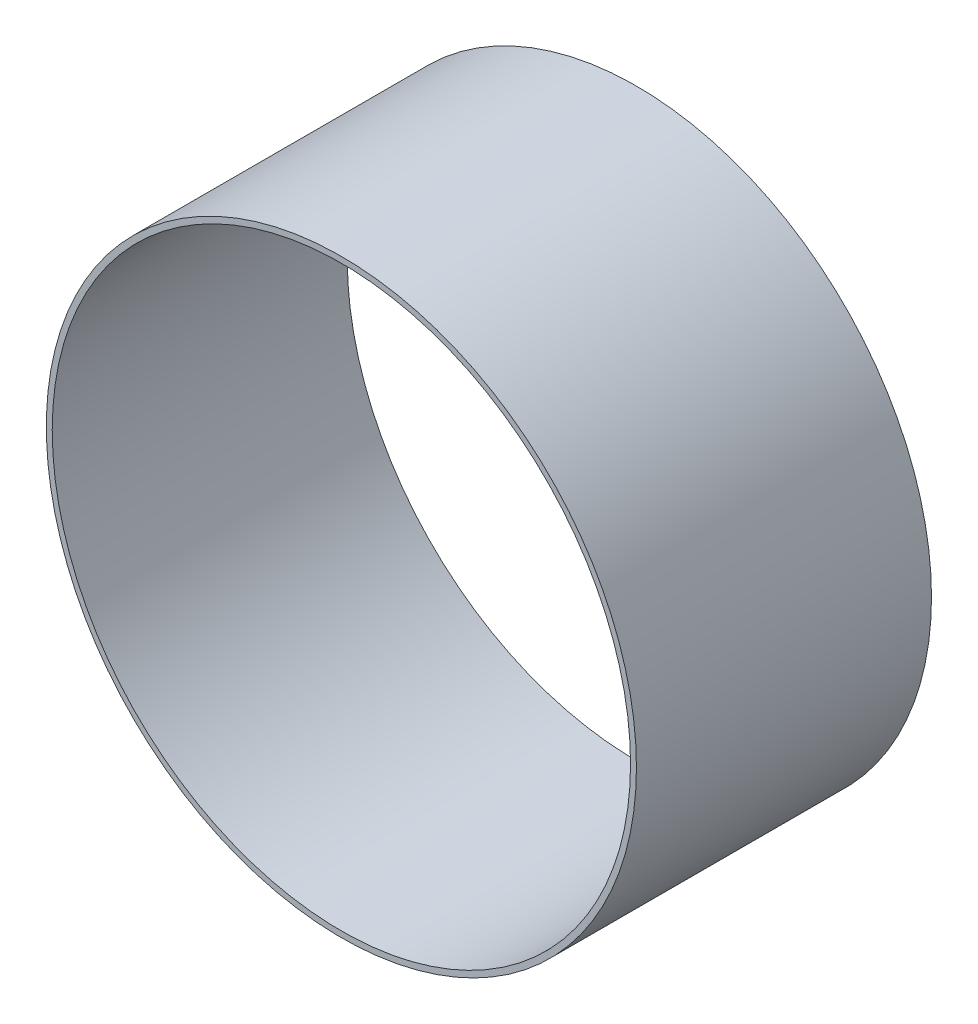
ISO-10303-21;
HEADER;
FILE_DESCRIPTION(('STEP AP214'),'2;1');
FILE_NAME('part.step','',(''),(''),'','','');
FILE_SCHEMA(('AUTOMOTIVE_DESIGN { 1 0 10303 214 1 1 1 1 }'));
ENDSEC;
DATA;
#1=APPLICATION_CONTEXT('core data for automotive mechanical design processes');
#2=APPLICATION_PROTOCOL_DEFINITION('international standard','automotive_design',2000,#1);
#3=PRODUCT_CONTEXT('',#1,'mechanical');
#4=PRODUCT('Part','Part','',(#3));
#5=PRODUCT_RELATED_PRODUCT_CATEGORY('part','',(#4));
#6=PRODUCT_DEFINITION_FORMATION('','',#4);
#7=PRODUCT_DEFINITION_CONTEXT('part definition',#1,'design');
#8=PRODUCT_DEFINITION('design','',#6,#7);
#9=PRODUCT_DEFINITION_SHAPE('','',#8);
#10=(LENGTH_UNIT() NAMED_UNIT(*) SI_UNIT(.MILLI.,.METRE.));
#11=(NAMED_UNIT(*) PLANE_ANGLE_UNIT() SI_UNIT($,.RADIAN.));
#12=(NAMED_UNIT(*) SI_UNIT($,.STERADIAN.) SOLID_ANGLE_UNIT());
#13=UNCERTAINTY_MEASURE_WITH_UNIT(LENGTH_MEASURE(1.E-05),#10,'distance_accuracy_value','');
#14=(GEOMETRIC_REPRESENTATION_CONTEXT(3) GLOBAL_UNCERTAINTY_ASSIGNED_CONTEXT((#13)) GLOBAL_UNIT_ASSIGNED_CONTEXT((#10,
#11,#12)) REPRESENTATION_CONTEXT('',''));
#15=CARTESIAN_POINT('',(0.,0.,0.));
#16=DIRECTION('',(0.,0.,1.));
#17=DIRECTION('',(1.,0.,0.));
#18=AXIS2_PLACEMENT_3D('',#15,#16,#17);
#19=CARTESIAN_POINT('',(0.,0.,50.));
#20=DIRECTION('',(0.,0.,1.));
#21=DIRECTION('',(1.,0.,0.));
#22=AXIS2_PLACEMENT_3D('',#19,#20,#21);
#23=PLANE('',#22);
#24=CARTESIAN_POINT('',(0.,0.,50.));
#25=DIRECTION('',(0.,0.,1.));
#26=DIRECTION('',(1.,0.,0.));
#27=AXIS2_PLACEMENT_3D('',#24,#25,#26);
#28=CIRCLE('',#27,50.);
#29=CARTESIAN_POINT('',(50.,0.,50.));
#30=VERTEX_POINT('',#29);
#31=EDGE_CURVE('E10',#30,#30,#28,.T.);
#32=ORIENTED_EDGE('',*,*,#31,.T.);
#33=EDGE_LOOP('',(#32));
#34=FACE_BOUND('',#33,.T.);
#35=CARTESIAN_POINT('',(0.,0.,50.));
#36=DIRECTION('',(0.,0.,1.));
#37=DIRECTION('',(1.,0.,0.));
#38=AXIS2_PLACEMENT_3D('',#35,#36,#37);
#39=CIRCLE('',#38,49.);
#40=CARTESIAN_POINT('',(49.,0.,50.));
#41=VERTEX_POINT('',#40);
#42=EDGE_CURVE('E42',#41,#41,#39,.T.);
#43=ORIENTED_EDGE('',*,*,#42,.F.);
#44=EDGE_LOOP('',(#43));
#45=FACE_BOUND('',#44,.T.);
#46=ADVANCED_FACE('F31',(#34,#45),#23,.T.);
#47=CARTESIAN_POINT('',(0.,0.,0.));
#48=DIRECTION('',(0.,0.,1.));
#49=DIRECTION('',(1.,0.,0.));
#50=AXIS2_PLACEMENT_3D('',#47,#48,#49);
#51=PLANE('',#50);
#52=CARTESIAN_POINT('',(0.,0.,0.));
#53=DIRECTION('',(0.,0.,1.));
#54=DIRECTION('',(1.,0.,0.));
#55=AXIS2_PLACEMENT_3D('',#52,#53,#54);
#56=CIRCLE('',#55,50.);
#57=CARTESIAN_POINT('',(50.,0.,0.));
#58=VERTEX_POINT('',#57);
#59=EDGE_CURVE('E35',#58,#58,#56,.T.);
#60=ORIENTED_EDGE('',*,*,#59,.F.);
#61=EDGE_LOOP('',(#60));
#62=FACE_BOUND('',#61,.T.);
#63=CARTESIAN_POINT('',(0.,0.,0.));
#64=DIRECTION('',(0.,0.,1.));
#65=DIRECTION('',(1.,0.,0.));
#66=AXIS2_PLACEMENT_3D('',#63,#64,#65);
#67=CIRCLE('',#66,49.);
#68=CARTESIAN_POINT('',(49.,0.,0.));
#69=VERTEX_POINT('',#68);
#70=EDGE_CURVE('E44',#69,#69,#67,.T.);
#71=ORIENTED_EDGE('',*,*,#70,.T.);
#72=EDGE_LOOP('',(#71));
#73=FACE_BOUND('',#72,.T.);
#74=ADVANCED_FACE('F54',(#62,#73),#51,.F.);
#75=CARTESIAN_POINT('',(0.,0.,50.));
#76=DIRECTION('',(0.,0.,-1.));
#77=DIRECTION('',(-1.,0.,0.));
#78=AXIS2_PLACEMENT_3D('',#75,#76,#77);
#79=CYLINDRICAL_SURFACE('',#78,50.);
#80=ORIENTED_EDGE('',*,*,#31,.F.);
#81=EDGE_LOOP('',(#80));
#82=FACE_BOUND('',#81,.T.);
#83=ORIENTED_EDGE('',*,*,#59,.T.);
#84=EDGE_LOOP('',(#83));
#85=FACE_BOUND('',#84,.T.);
#86=ADVANCED_FACE('F33',(#82,#85),#79,.T.);
#87=CARTESIAN_POINT('',(0.,0.,50.));
#88=DIRECTION('',(0.,0.,-1.));
#89=DIRECTION('',(-1.,0.,0.));
#90=AXIS2_PLACEMENT_3D('',#87,#88,#89);
#91=CYLINDRICAL_SURFACE('',#90,49.);
#92=ORIENTED_EDGE('',*,*,#42,.T.);
#93=EDGE_LOOP('',(#92));
#94=FACE_BOUND('',#93,.T.);
#95=ORIENTED_EDGE('',*,*,#70,.F.);
#96=EDGE_LOOP('',(#95));
#97=FACE_BOUND('',#96,.T.);
#98=ADVANCED_FACE('F50',(#94,#97),#91,.F.);
#99=CLOSED_SHELL('',(#46,#74,#86,#98));
#100=MANIFOLD_SOLID_BREP('B2',#99);
#101=ADVANCED_BREP_SHAPE_REPRESENTATION('',(#18,#100),#14);
#102=SHAPE_DEFINITION_REPRESENTATION(#9,#101);
ENDSEC;
END-ISO-10303-21;
